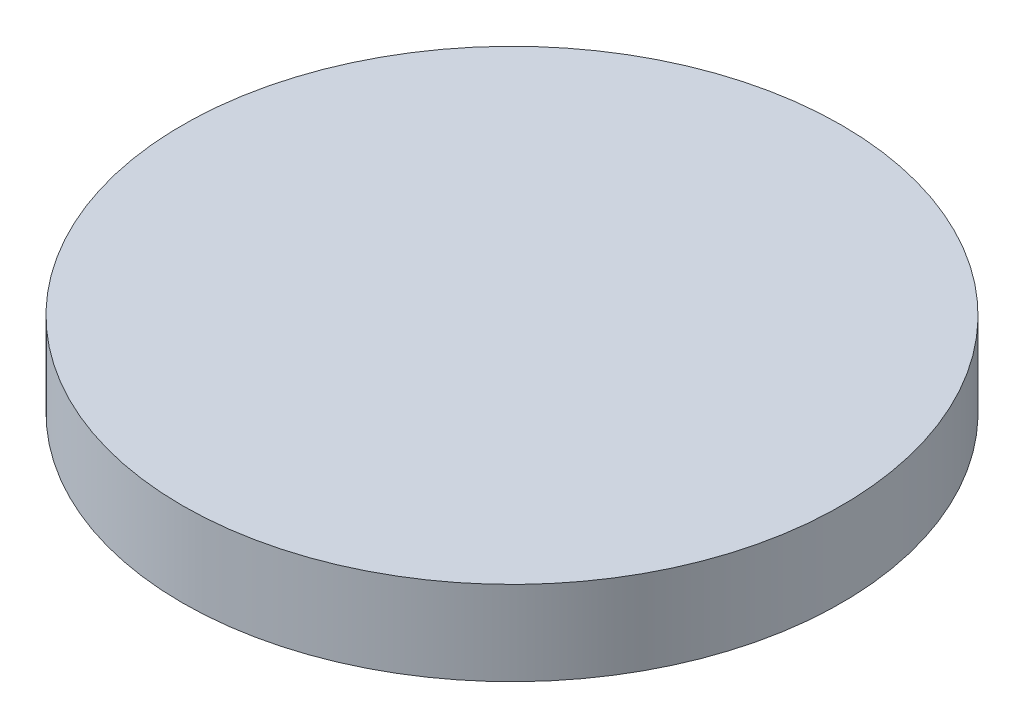
ISO-10303-21;
HEADER;
FILE_DESCRIPTION(('STEP AP214'),'2;1');
FILE_NAME('part.step','',(''),(''),'','','');
FILE_SCHEMA(('AUTOMOTIVE_DESIGN { 1 0 10303 214 1 1 1 1 }'));
ENDSEC;
DATA;
#1=APPLICATION_CONTEXT('core data for automotive mechanical design processes');
#2=APPLICATION_PROTOCOL_DEFINITION('international standard','automotive_design',2000,#1);
#3=PRODUCT_CONTEXT('',#1,'mechanical');
#4=PRODUCT('Part','Part','',(#3));
#5=PRODUCT_RELATED_PRODUCT_CATEGORY('part','',(#4));
#6=PRODUCT_DEFINITION_FORMATION('','',#4);
#7=PRODUCT_DEFINITION_CONTEXT('part definition',#1,'design');
#8=PRODUCT_DEFINITION('design','',#6,#7);
#9=PRODUCT_DEFINITION_SHAPE('','',#8);
#10=(LENGTH_UNIT() NAMED_UNIT(*) SI_UNIT(.MILLI.,.METRE.));
#11=(NAMED_UNIT(*) PLANE_ANGLE_UNIT() SI_UNIT($,.RADIAN.));
#12=(NAMED_UNIT(*) SI_UNIT($,.STERADIAN.) SOLID_ANGLE_UNIT());
#13=UNCERTAINTY_MEASURE_WITH_UNIT(LENGTH_MEASURE(1.E-05),#10,'distance_accuracy_value','');
#14=(GEOMETRIC_REPRESENTATION_CONTEXT(3) GLOBAL_UNCERTAINTY_ASSIGNED_CONTEXT((#13)) GLOBAL_UNIT_ASSIGNED_CONTEXT((#10,
#11,#12)) REPRESENTATION_CONTEXT('',''));
#15=CARTESIAN_POINT('',(0.,0.,0.));
#16=DIRECTION('',(0.,0.,1.));
#17=DIRECTION('',(1.,0.,0.));
#18=AXIS2_PLACEMENT_3D('',#15,#16,#17);
#19=CARTESIAN_POINT('',(0.,4.698,0.));
#20=DIRECTION('',(0.,-1.,0.));
#21=DIRECTION('',(0.,0.,-1.));
#22=AXIS2_PLACEMENT_3D('',#19,#20,#21);
#23=CYLINDRICAL_SURFACE('',#22,18.375);
#24=CARTESIAN_POINT('',(0.,4.698,0.));
#25=DIRECTION('',(0.,1.,0.));
#26=DIRECTION('',(0.,0.,1.));
#27=AXIS2_PLACEMENT_3D('',#24,#25,#26);
#28=CIRCLE('',#27,18.375);
#29=CARTESIAN_POINT('',(0.,4.698,18.375));
#30=VERTEX_POINT('',#29);
#31=EDGE_CURVE('E10',#30,#30,#28,.T.);
#32=ORIENTED_EDGE('',*,*,#31,.F.);
#33=EDGE_LOOP('',(#32));
#34=FACE_BOUND('',#33,.T.);
#35=CARTESIAN_POINT('',(0.,0.,0.));
#36=DIRECTION('',(0.,1.,0.));
#37=DIRECTION('',(0.,0.,1.));
#38=AXIS2_PLACEMENT_3D('',#35,#36,#37);
#39=CIRCLE('',#38,18.375);
#40=CARTESIAN_POINT('',(0.,0.,18.375));
#41=VERTEX_POINT('',#40);
#42=EDGE_CURVE('E34',#41,#41,#39,.T.);
#43=ORIENTED_EDGE('',*,*,#42,.T.);
#44=EDGE_LOOP('',(#43));
#45=FACE_BOUND('',#44,.T.);
#46=ADVANCED_FACE('F31',(#34,#45),#23,.T.);
#47=CARTESIAN_POINT('',(0.,4.698,0.));
#48=DIRECTION('',(0.,1.,0.));
#49=DIRECTION('',(0.,0.,1.));
#50=AXIS2_PLACEMENT_3D('',#47,#48,#49);
#51=PLANE('',#50);
#52=ORIENTED_EDGE('',*,*,#31,.T.);
#53=EDGE_LOOP('',(#52));
#54=FACE_BOUND('',#53,.T.);
#55=ADVANCED_FACE('F46',(#54),#51,.T.);
#56=CARTESIAN_POINT('',(0.,0.,0.));
#57=DIRECTION('',(0.,1.,0.));
#58=DIRECTION('',(0.,0.,1.));
#59=AXIS2_PLACEMENT_3D('',#56,#57,#58);
#60=PLANE('',#59);
#61=ORIENTED_EDGE('',*,*,#42,.F.);
#62=EDGE_LOOP('',(#61));
#63=FACE_BOUND('',#62,.T.);
#64=ADVANCED_FACE('F44',(#63),#60,.F.);
#65=CLOSED_SHELL('',(#46,#55,#64));
#66=MANIFOLD_SOLID_BREP('B2',#65);
#67=ADVANCED_BREP_SHAPE_REPRESENTATION('',(#18,#66),#14);
#68=SHAPE_DEFINITION_REPRESENTATION(#9,#67);
ENDSEC;
END-ISO-10303-21;
